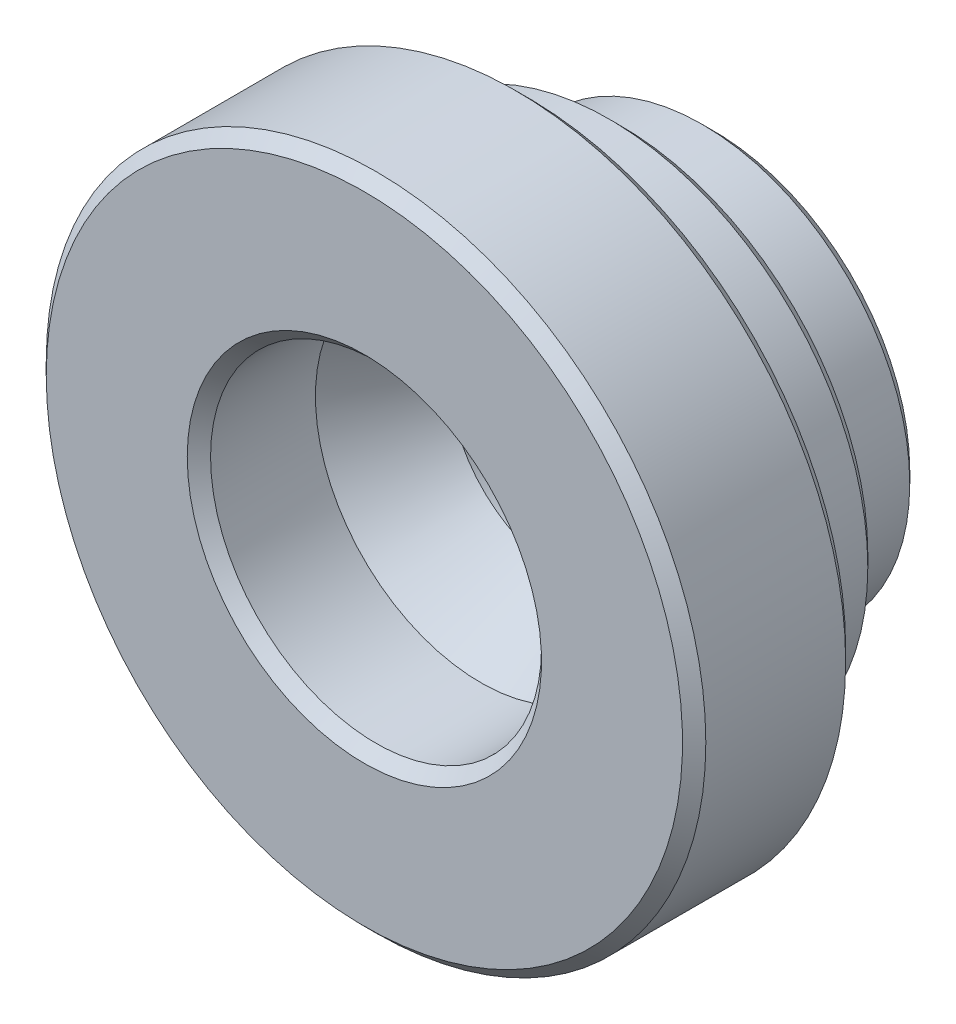
ISO-10303-21;
HEADER;
FILE_DESCRIPTION(('STEP AP214'),'2;1');
FILE_NAME('part.step','',(''),(''),'','','');
FILE_SCHEMA(('AUTOMOTIVE_DESIGN { 1 0 10303 214 1 1 1 1 }'));
ENDSEC;
DATA;
#1=APPLICATION_CONTEXT('core data for automotive mechanical design processes');
#2=APPLICATION_PROTOCOL_DEFINITION('international standard','automotive_design',2000,#1);
#3=PRODUCT_CONTEXT('',#1,'mechanical');
#4=PRODUCT('Part','Part','',(#3));
#5=PRODUCT_RELATED_PRODUCT_CATEGORY('part','',(#4));
#6=PRODUCT_DEFINITION_FORMATION('','',#4);
#7=PRODUCT_DEFINITION_CONTEXT('part definition',#1,'design');
#8=PRODUCT_DEFINITION('design','',#6,#7);
#9=PRODUCT_DEFINITION_SHAPE('','',#8);
#10=(LENGTH_UNIT() NAMED_UNIT(*) SI_UNIT(.MILLI.,.METRE.));
#11=(NAMED_UNIT(*) PLANE_ANGLE_UNIT() SI_UNIT($,.RADIAN.));
#12=(NAMED_UNIT(*) SI_UNIT($,.STERADIAN.) SOLID_ANGLE_UNIT());
#13=UNCERTAINTY_MEASURE_WITH_UNIT(LENGTH_MEASURE(1.E-05),#10,'distance_accuracy_value','');
#14=(GEOMETRIC_REPRESENTATION_CONTEXT(3) GLOBAL_UNCERTAINTY_ASSIGNED_CONTEXT((#13)) GLOBAL_UNIT_ASSIGNED_CONTEXT((#10,
#11,#12)) REPRESENTATION_CONTEXT('',''));
#15=CARTESIAN_POINT('',(0.,0.,0.));
#16=DIRECTION('',(0.,0.,1.));
#17=DIRECTION('',(1.,0.,0.));
#18=AXIS2_PLACEMENT_3D('',#15,#16,#17);
#19=CARTESIAN_POINT('',(0.,8.9,-15.));
#20=DIRECTION('',(0.,0.,1.));
#21=DIRECTION('',(1.,0.,0.));
#22=AXIS2_PLACEMENT_3D('',#19,#20,#21);
#23=PLANE('',#22);
#24=CARTESIAN_POINT('',(0.,0.,-15.));
#25=DIRECTION('',(0.,0.,1.));
#26=DIRECTION('',(1.,0.,0.));
#27=AXIS2_PLACEMENT_3D('',#24,#25,#26);
#28=CIRCLE('',#27,8.4);
#29=CARTESIAN_POINT('',(8.4,0.,-15.));
#30=VERTEX_POINT('',#29);
#31=EDGE_CURVE('E10',#30,#30,#28,.F.);
#32=ORIENTED_EDGE('',*,*,#31,.T.);
#33=EDGE_LOOP('',(#32));
#34=FACE_BOUND('',#33,.T.);
#35=CARTESIAN_POINT('',(0.,0.,-15.));
#36=DIRECTION('',(0.,0.,1.));
#37=DIRECTION('',(1.,0.,0.));
#38=AXIS2_PLACEMENT_3D('',#35,#36,#37);
#39=CIRCLE('',#38,5.);
#40=CARTESIAN_POINT('',(5.,0.,-15.));
#41=VERTEX_POINT('',#40);
#42=EDGE_CURVE('E110',#41,#41,#39,.T.);
#43=ORIENTED_EDGE('',*,*,#42,.T.);
#44=EDGE_LOOP('',(#43));
#45=FACE_BOUND('',#44,.T.);
#46=ADVANCED_FACE('F45',(#34,#45),#23,.F.);
#47=CARTESIAN_POINT('',(0.,0.,0.));
#48=DIRECTION('',(0.,0.,1.));
#49=DIRECTION('',(1.,0.,0.));
#50=AXIS2_PLACEMENT_3D('',#47,#48,#49);
#51=CYLINDRICAL_SURFACE('',#50,8.9);
#52=CARTESIAN_POINT('',(0.,0.,-14.5));
#53=DIRECTION('',(0.,0.,1.));
#54=DIRECTION('',(1.,0.,0.));
#55=AXIS2_PLACEMENT_3D('',#52,#53,#54);
#56=CIRCLE('',#55,8.9);
#57=CARTESIAN_POINT('',(8.9,0.,-14.5));
#58=VERTEX_POINT('',#57);
#59=EDGE_CURVE('E54',#58,#58,#56,.T.);
#60=ORIENTED_EDGE('',*,*,#59,.T.);
#61=EDGE_LOOP('',(#60));
#62=FACE_BOUND('',#61,.T.);
#63=CARTESIAN_POINT('',(0.,0.,-11.));
#64=DIRECTION('',(0.,0.,1.));
#65=DIRECTION('',(1.,0.,0.));
#66=AXIS2_PLACEMENT_3D('',#63,#64,#65);
#67=CIRCLE('',#66,8.9);
#68=CARTESIAN_POINT('',(8.9,0.,-11.));
#69=VERTEX_POINT('',#68);
#70=EDGE_CURVE('E94',#69,#69,#67,.T.);
#71=ORIENTED_EDGE('',*,*,#70,.F.);
#72=EDGE_LOOP('',(#71));
#73=FACE_BOUND('',#72,.T.);
#74=ADVANCED_FACE('F142',(#62,#73),#51,.T.);
#75=CARTESIAN_POINT('',(0.,8.9,-11.));
#76=DIRECTION('',(0.,0.,1.));
#77=DIRECTION('',(1.,0.,0.));
#78=AXIS2_PLACEMENT_3D('',#75,#76,#77);
#79=PLANE('',#78);
#80=CARTESIAN_POINT('',(0.,0.,-11.));
#81=DIRECTION('',(0.,0.,1.));
#82=DIRECTION('',(1.,0.,0.));
#83=AXIS2_PLACEMENT_3D('',#80,#81,#82);
#84=CIRCLE('',#83,10.6);
#85=CARTESIAN_POINT('',(10.6,0.,-11.));
#86=VERTEX_POINT('',#85);
#87=EDGE_CURVE('E59',#86,#86,#84,.F.);
#88=ORIENTED_EDGE('',*,*,#87,.T.);
#89=EDGE_LOOP('',(#88));
#90=FACE_BOUND('',#89,.T.);
#91=ORIENTED_EDGE('',*,*,#70,.T.);
#92=EDGE_LOOP('',(#91));
#93=FACE_BOUND('',#92,.T.);
#94=ADVANCED_FACE('F147',(#90,#93),#79,.F.);
#95=CARTESIAN_POINT('',(0.,0.,0.));
#96=DIRECTION('',(0.,0.,1.));
#97=DIRECTION('',(1.,0.,0.));
#98=AXIS2_PLACEMENT_3D('',#95,#96,#97);
#99=CYLINDRICAL_SURFACE('',#98,11.1);
#100=CARTESIAN_POINT('',(0.,0.,-10.5));
#101=DIRECTION('',(0.,0.,1.));
#102=DIRECTION('',(1.,0.,0.));
#103=AXIS2_PLACEMENT_3D('',#100,#101,#102);
#104=CIRCLE('',#103,11.1);
#105=CARTESIAN_POINT('',(11.1,0.,-10.5));
#106=VERTEX_POINT('',#105);
#107=EDGE_CURVE('E64',#106,#106,#104,.T.);
#108=ORIENTED_EDGE('',*,*,#107,.T.);
#109=EDGE_LOOP('',(#108));
#110=FACE_BOUND('',#109,.T.);
#111=CARTESIAN_POINT('',(0.,0.,-7.));
#112=DIRECTION('',(0.,0.,1.));
#113=DIRECTION('',(1.,0.,0.));
#114=AXIS2_PLACEMENT_3D('',#111,#112,#113);
#115=CIRCLE('',#114,11.1);
#116=CARTESIAN_POINT('',(11.1,0.,-7.));
#117=VERTEX_POINT('',#116);
#118=EDGE_CURVE('E98',#117,#117,#115,.T.);
#119=ORIENTED_EDGE('',*,*,#118,.F.);
#120=EDGE_LOOP('',(#119));
#121=FACE_BOUND('',#120,.T.);
#122=ADVANCED_FACE('F183',(#110,#121),#99,.T.);
#123=CARTESIAN_POINT('',(0.,11.1,-7.));
#124=DIRECTION('',(0.,0.,1.));
#125=DIRECTION('',(1.,0.,0.));
#126=AXIS2_PLACEMENT_3D('',#123,#124,#125);
#127=PLANE('',#126);
#128=CARTESIAN_POINT('',(0.,0.,-7.));
#129=DIRECTION('',(0.,0.,1.));
#130=DIRECTION('',(1.,0.,0.));
#131=AXIS2_PLACEMENT_3D('',#128,#129,#130);
#132=CIRCLE('',#131,13.65);
#133=CARTESIAN_POINT('',(13.65,0.,-7.));
#134=VERTEX_POINT('',#133);
#135=EDGE_CURVE('E70',#134,#134,#132,.F.);
#136=ORIENTED_EDGE('',*,*,#135,.T.);
#137=EDGE_LOOP('',(#136));
#138=FACE_BOUND('',#137,.T.);
#139=ORIENTED_EDGE('',*,*,#118,.T.);
#140=EDGE_LOOP('',(#139));
#141=FACE_BOUND('',#140,.T.);
#142=ADVANCED_FACE('F186',(#138,#141),#127,.F.);
#143=CARTESIAN_POINT('',(0.,0.,0.));
#144=DIRECTION('',(0.,0.,1.));
#145=DIRECTION('',(1.,0.,0.));
#146=AXIS2_PLACEMENT_3D('',#143,#144,#145);
#147=CYLINDRICAL_SURFACE('',#146,14.15);
#148=CARTESIAN_POINT('',(0.,0.,-0.499999999999991));
#149=DIRECTION('',(0.,0.,-1.));
#150=DIRECTION('',(-1.,0.,0.));
#151=AXIS2_PLACEMENT_3D('',#148,#149,#150);
#152=CIRCLE('',#151,14.15);
#153=CARTESIAN_POINT('',(-14.15,0.,-0.499999999999991));
#154=VERTEX_POINT('',#153);
#155=EDGE_CURVE('E78',#154,#154,#152,.T.);
#156=ORIENTED_EDGE('',*,*,#155,.T.);
#157=EDGE_LOOP('',(#156));
#158=FACE_BOUND('',#157,.T.);
#159=CARTESIAN_POINT('',(0.,0.,-6.5));
#160=DIRECTION('',(0.,0.,1.));
#161=DIRECTION('',(1.,0.,0.));
#162=AXIS2_PLACEMENT_3D('',#159,#160,#161);
#163=CIRCLE('',#162,14.15);
#164=CARTESIAN_POINT('',(14.15,0.,-6.5));
#165=VERTEX_POINT('',#164);
#166=EDGE_CURVE('E82',#165,#165,#163,.T.);
#167=ORIENTED_EDGE('',*,*,#166,.T.);
#168=EDGE_LOOP('',(#167));
#169=FACE_BOUND('',#168,.T.);
#170=ADVANCED_FACE('F138',(#158,#169),#147,.T.);
#171=CARTESIAN_POINT('',(0.,14.15,0.));
#172=DIRECTION('',(0.,0.,-1.));
#173=DIRECTION('',(-1.,0.,0.));
#174=AXIS2_PLACEMENT_3D('',#171,#172,#173);
#175=PLANE('',#174);
#176=CARTESIAN_POINT('',(0.,0.,0.));
#177=DIRECTION('',(0.,0.,-1.));
#178=DIRECTION('',(-1.,0.,0.));
#179=AXIS2_PLACEMENT_3D('',#176,#177,#178);
#180=CIRCLE('',#179,13.65);
#181=CARTESIAN_POINT('',(-13.65,0.,0.));
#182=VERTEX_POINT('',#181);
#183=EDGE_CURVE('E86',#182,#182,#180,.F.);
#184=ORIENTED_EDGE('',*,*,#183,.T.);
#185=EDGE_LOOP('',(#184));
#186=FACE_BOUND('',#185,.T.);
#187=CARTESIAN_POINT('',(0.,0.,0.));
#188=DIRECTION('',(0.,0.,-1.));
#189=DIRECTION('',(-1.,0.,0.));
#190=AXIS2_PLACEMENT_3D('',#187,#188,#189);
#191=CIRCLE('',#190,7.60000000000001);
#192=CARTESIAN_POINT('',(-7.60000000000001,0.,0.));
#193=VERTEX_POINT('',#192);
#194=EDGE_CURVE('E90',#193,#193,#191,.T.);
#195=ORIENTED_EDGE('',*,*,#194,.T.);
#196=EDGE_LOOP('',(#195));
#197=FACE_BOUND('',#196,.T.);
#198=ADVANCED_FACE('F131',(#186,#197),#175,.F.);
#199=CARTESIAN_POINT('',(0.,0.,0.));
#200=DIRECTION('',(0.,0.,1.));
#201=DIRECTION('',(1.,0.,0.));
#202=AXIS2_PLACEMENT_3D('',#199,#200,#201);
#203=CYLINDRICAL_SURFACE('',#202,7.1);
#204=CARTESIAN_POINT('',(0.,0.,-0.500000000000011));
#205=DIRECTION('',(0.,0.,-1.));
#206=DIRECTION('',(-1.,0.,0.));
#207=AXIS2_PLACEMENT_3D('',#204,#205,#206);
#208=CIRCLE('',#207,7.1);
#209=CARTESIAN_POINT('',(-7.1,0.,-0.500000000000011));
#210=VERTEX_POINT('',#209);
#211=EDGE_CURVE('E74',#210,#210,#208,.F.);
#212=ORIENTED_EDGE('',*,*,#211,.T.);
#213=EDGE_LOOP('',(#212));
#214=FACE_BOUND('',#213,.T.);
#215=CARTESIAN_POINT('',(0.,0.,-5.));
#216=DIRECTION('',(0.,0.,1.));
#217=DIRECTION('',(1.,0.,0.));
#218=AXIS2_PLACEMENT_3D('',#215,#216,#217);
#219=CIRCLE('',#218,7.1);
#220=CARTESIAN_POINT('',(7.1,0.,-5.));
#221=VERTEX_POINT('',#220);
#222=EDGE_CURVE('E102',#221,#221,#219,.T.);
#223=ORIENTED_EDGE('',*,*,#222,.F.);
#224=EDGE_LOOP('',(#223));
#225=FACE_BOUND('',#224,.T.);
#226=ADVANCED_FACE('F126',(#214,#225),#203,.F.);
#227=CARTESIAN_POINT('',(0.,0.,-5.));
#228=DIRECTION('',(0.,0.,1.));
#229=DIRECTION('',(1.,0.,0.));
#230=AXIS2_PLACEMENT_3D('',#227,#228,#229);
#231=CONICAL_SURFACE('',#230,7.1,0.523598775598301);
#232=CARTESIAN_POINT('',(0.,0.,-8.63730669589463));
#233=DIRECTION('',(0.,0.,1.));
#234=DIRECTION('',(1.,0.,0.));
#235=AXIS2_PLACEMENT_3D('',#232,#233,#234);
#236=CIRCLE('',#235,5.);
#237=CARTESIAN_POINT('',(5.,0.,-8.63730669589463));
#238=VERTEX_POINT('',#237);
#239=EDGE_CURVE('E106',#238,#238,#236,.T.);
#240=ORIENTED_EDGE('',*,*,#239,.F.);
#241=EDGE_LOOP('',(#240));
#242=FACE_BOUND('',#241,.T.);
#243=ORIENTED_EDGE('',*,*,#222,.T.);
#244=EDGE_LOOP('',(#243));
#245=FACE_BOUND('',#244,.T.);
#246=ADVANCED_FACE('F120',(#242,#245),#231,.F.);
#247=CARTESIAN_POINT('',(0.,0.,0.));
#248=DIRECTION('',(0.,0.,1.));
#249=DIRECTION('',(1.,0.,0.));
#250=AXIS2_PLACEMENT_3D('',#247,#248,#249);
#251=CYLINDRICAL_SURFACE('',#250,5.);
#252=ORIENTED_EDGE('',*,*,#42,.F.);
#253=EDGE_LOOP('',(#252));
#254=FACE_BOUND('',#253,.T.);
#255=ORIENTED_EDGE('',*,*,#239,.T.);
#256=EDGE_LOOP('',(#255));
#257=FACE_BOUND('',#256,.T.);
#258=ADVANCED_FACE('F116',(#254,#257),#251,.F.);
#259=CARTESIAN_POINT('',(0.,0.,0.));
#260=DIRECTION('',(0.,0.,-1.));
#261=DIRECTION('',(-1.,0.,0.));
#262=AXIS2_PLACEMENT_3D('',#259,#260,#261);
#263=CONICAL_SURFACE('',#262,13.65,0.785398163397445);
#264=ORIENTED_EDGE('',*,*,#155,.F.);
#265=EDGE_LOOP('',(#264));
#266=FACE_BOUND('',#265,.T.);
#267=ORIENTED_EDGE('',*,*,#183,.F.);
#268=EDGE_LOOP('',(#267));
#269=FACE_BOUND('',#268,.T.);
#270=ADVANCED_FACE('F119',(#266,#269),#263,.T.);
#271=CARTESIAN_POINT('',(0.,0.,-0.500000000000011));
#272=DIRECTION('',(0.,0.,1.));
#273=DIRECTION('',(1.,0.,0.));
#274=AXIS2_PLACEMENT_3D('',#271,#272,#273);
#275=CONICAL_SURFACE('',#274,7.1,0.785398163397444);
#276=ORIENTED_EDGE('',*,*,#194,.F.);
#277=EDGE_LOOP('',(#276));
#278=FACE_BOUND('',#277,.T.);
#279=ORIENTED_EDGE('',*,*,#211,.F.);
#280=EDGE_LOOP('',(#279));
#281=FACE_BOUND('',#280,.T.);
#282=ADVANCED_FACE('F156',(#278,#281),#275,.F.);
#283=CARTESIAN_POINT('',(0.,0.,-6.5));
#284=DIRECTION('',(0.,0.,1.));
#285=DIRECTION('',(1.,0.,0.));
#286=AXIS2_PLACEMENT_3D('',#283,#284,#285);
#287=CONICAL_SURFACE('',#286,14.15,0.785398163397452);
#288=ORIENTED_EDGE('',*,*,#135,.F.);
#289=EDGE_LOOP('',(#288));
#290=FACE_BOUND('',#289,.T.);
#291=ORIENTED_EDGE('',*,*,#166,.F.);
#292=EDGE_LOOP('',(#291));
#293=FACE_BOUND('',#292,.T.);
#294=ADVANCED_FACE('F163',(#290,#293),#287,.T.);
#295=CARTESIAN_POINT('',(0.,0.,-10.5));
#296=DIRECTION('',(0.,0.,1.));
#297=DIRECTION('',(1.,0.,0.));
#298=AXIS2_PLACEMENT_3D('',#295,#296,#297);
#299=CONICAL_SURFACE('',#298,11.1,0.785398163397452);
#300=ORIENTED_EDGE('',*,*,#87,.F.);
#301=EDGE_LOOP('',(#300));
#302=FACE_BOUND('',#301,.T.);
#303=ORIENTED_EDGE('',*,*,#107,.F.);
#304=EDGE_LOOP('',(#303));
#305=FACE_BOUND('',#304,.T.);
#306=ADVANCED_FACE('F169',(#302,#305),#299,.T.);
#307=CARTESIAN_POINT('',(0.,0.,-14.5));
#308=DIRECTION('',(0.,0.,1.));
#309=DIRECTION('',(1.,0.,0.));
#310=AXIS2_PLACEMENT_3D('',#307,#308,#309);
#311=CONICAL_SURFACE('',#310,8.9,0.785398163397452);
#312=ORIENTED_EDGE('',*,*,#31,.F.);
#313=EDGE_LOOP('',(#312));
#314=FACE_BOUND('',#313,.T.);
#315=ORIENTED_EDGE('',*,*,#59,.F.);
#316=EDGE_LOOP('',(#315));
#317=FACE_BOUND('',#316,.T.);
#318=ADVANCED_FACE('F48',(#314,#317),#311,.T.);
#319=CLOSED_SHELL('',(#46,#74,#94,#122,#142,#170,#198,#226,#246,#258,#270,#282,#294,#306,#318));
#320=MANIFOLD_SOLID_BREP('B2',#319);
#321=ADVANCED_BREP_SHAPE_REPRESENTATION('',(#18,#320),#14);
#322=SHAPE_DEFINITION_REPRESENTATION(#9,#321);
ENDSEC;
END-ISO-10303-21;
